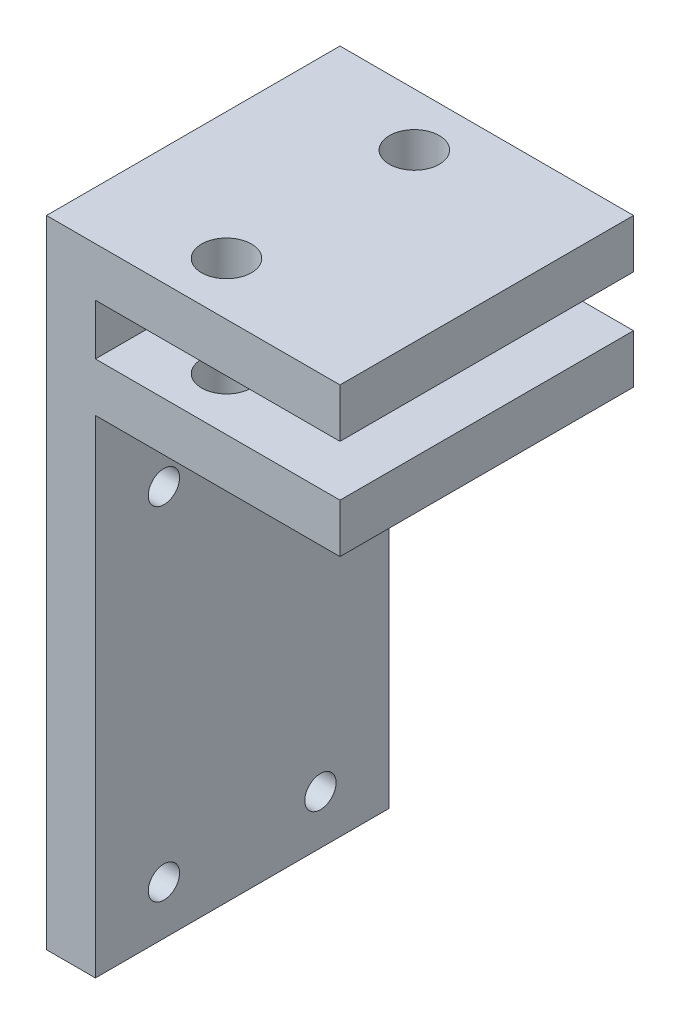
ISO-10303-21;
HEADER;
FILE_DESCRIPTION(('STEP AP214'),'2;1');
FILE_NAME('part.step','',(''),(''),'','','');
FILE_SCHEMA(('AUTOMOTIVE_DESIGN { 1 0 10303 214 1 1 1 1 }'));
ENDSEC;
DATA;
#1=APPLICATION_CONTEXT('core data for automotive mechanical design processes');
#2=APPLICATION_PROTOCOL_DEFINITION('international standard','automotive_design',2000,#1);
#3=PRODUCT_CONTEXT('',#1,'mechanical');
#4=PRODUCT('Part','Part','',(#3));
#5=PRODUCT_RELATED_PRODUCT_CATEGORY('part','',(#4));
#6=PRODUCT_DEFINITION_FORMATION('','',#4);
#7=PRODUCT_DEFINITION_CONTEXT('part definition',#1,'design');
#8=PRODUCT_DEFINITION('design','',#6,#7);
#9=PRODUCT_DEFINITION_SHAPE('','',#8);
#10=(LENGTH_UNIT() NAMED_UNIT(*) SI_UNIT(.MILLI.,.METRE.));
#11=(NAMED_UNIT(*) PLANE_ANGLE_UNIT() SI_UNIT($,.RADIAN.));
#12=(NAMED_UNIT(*) SI_UNIT($,.STERADIAN.) SOLID_ANGLE_UNIT());
#13=UNCERTAINTY_MEASURE_WITH_UNIT(LENGTH_MEASURE(1.E-05),#10,'distance_accuracy_value','');
#14=(GEOMETRIC_REPRESENTATION_CONTEXT(3) GLOBAL_UNCERTAINTY_ASSIGNED_CONTEXT((#13)) GLOBAL_UNIT_ASSIGNED_CONTEXT((#10,
#11,#12)) REPRESENTATION_CONTEXT('',''));
#15=CARTESIAN_POINT('',(0.,0.,0.));
#16=DIRECTION('',(0.,0.,1.));
#17=DIRECTION('',(1.,0.,0.));
#18=AXIS2_PLACEMENT_3D('',#15,#16,#17);
#19=CARTESIAN_POINT('',(-25.,0.,30.));
#20=DIRECTION('',(0.,1.,0.));
#21=DIRECTION('',(0.,0.,1.));
#22=AXIS2_PLACEMENT_3D('',#19,#20,#21);
#23=PLANE('',#22);
#24=CARTESIAN_POINT('',(-17.,0.,5.4));
#25=DIRECTION('',(0.,1.,0.));
#26=DIRECTION('',(0.,0.,1.));
#27=AXIS2_PLACEMENT_3D('',#24,#25,#26);
#28=CIRCLE('',#27,2.55);
#29=CARTESIAN_POINT('',(-17.,0.,7.95));
#30=VERTEX_POINT('',#29);
#31=EDGE_CURVE('E240',#30,#30,#28,.T.);
#32=ORIENTED_EDGE('',*,*,#31,.T.);
#33=EDGE_LOOP('',(#32));
#34=FACE_BOUND('',#33,.T.);
#35=CARTESIAN_POINT('',(-17.,0.,24.6));
#36=DIRECTION('',(0.,1.,0.));
#37=DIRECTION('',(0.,0.,1.));
#38=AXIS2_PLACEMENT_3D('',#35,#36,#37);
#39=CIRCLE('',#38,2.55);
#40=CARTESIAN_POINT('',(-17.,0.,27.15));
#41=VERTEX_POINT('',#40);
#42=EDGE_CURVE('E222',#41,#41,#39,.T.);
#43=ORIENTED_EDGE('',*,*,#42,.T.);
#44=EDGE_LOOP('',(#43));
#45=FACE_BOUND('',#44,.T.);
#46=DIRECTION('',(1.,0.,0.));
#47=VECTOR('',#46,1.);
#48=CARTESIAN_POINT('',(-25.,0.,0.));
#49=LINE('',#48,#47);
#50=CARTESIAN_POINT('',(-25.,0.,0.));
#51=VERTEX_POINT('',#50);
#52=CARTESIAN_POINT('',(0.,0.,0.));
#53=VERTEX_POINT('',#52);
#54=EDGE_CURVE('E158',#51,#53,#49,.T.);
#55=ORIENTED_EDGE('',*,*,#54,.T.);
#56=DIRECTION('',(0.,0.,-1.));
#57=VECTOR('',#56,1.);
#58=CARTESIAN_POINT('',(0.,0.,30.));
#59=LINE('',#58,#57);
#60=CARTESIAN_POINT('',(0.,0.,30.));
#61=VERTEX_POINT('',#60);
#62=EDGE_CURVE('E11',#61,#53,#59,.T.);
#63=ORIENTED_EDGE('',*,*,#62,.F.);
#64=DIRECTION('',(1.,0.,0.));
#65=VECTOR('',#64,1.);
#66=CARTESIAN_POINT('',(-25.,0.,30.));
#67=LINE('',#66,#65);
#68=CARTESIAN_POINT('',(-25.,0.,30.));
#69=VERTEX_POINT('',#68);
#70=EDGE_CURVE('E187',#69,#61,#67,.T.);
#71=ORIENTED_EDGE('',*,*,#70,.F.);
#72=DIRECTION('',(0.,0.,-1.));
#73=VECTOR('',#72,1.);
#74=CARTESIAN_POINT('',(-25.,0.,30.));
#75=LINE('',#74,#73);
#76=EDGE_CURVE('E154',#69,#51,#75,.T.);
#77=ORIENTED_EDGE('',*,*,#76,.T.);
#78=EDGE_LOOP('',(#55,#63,#71,#77));
#79=FACE_BOUND('',#78,.T.);
#80=ADVANCED_FACE('F43',(#34,#45,#79),#23,.F.);
#81=CARTESIAN_POINT('',(0.,0.,30.));
#82=DIRECTION('',(-1.,0.,0.));
#83=DIRECTION('',(0.,0.,1.));
#84=AXIS2_PLACEMENT_3D('',#81,#82,#83);
#85=PLANE('',#84);
#86=DIRECTION('',(0.,1.,0.));
#87=VECTOR('',#86,1.);
#88=CARTESIAN_POINT('',(0.,0.,0.));
#89=LINE('',#88,#87);
#90=CARTESIAN_POINT('',(0.,5.,0.));
#91=VERTEX_POINT('',#90);
#92=EDGE_CURVE('E162',#53,#91,#89,.T.);
#93=ORIENTED_EDGE('',*,*,#92,.T.);
#94=DIRECTION('',(0.,0.,-1.));
#95=VECTOR('',#94,1.);
#96=CARTESIAN_POINT('',(0.,5.,30.));
#97=LINE('',#96,#95);
#98=CARTESIAN_POINT('',(0.,5.,30.));
#99=VERTEX_POINT('',#98);
#100=EDGE_CURVE('E53',#99,#91,#97,.T.);
#101=ORIENTED_EDGE('',*,*,#100,.F.);
#102=DIRECTION('',(0.,1.,0.));
#103=VECTOR('',#102,1.);
#104=CARTESIAN_POINT('',(0.,0.,30.));
#105=LINE('',#104,#103);
#106=EDGE_CURVE('E111',#61,#99,#105,.T.);
#107=ORIENTED_EDGE('',*,*,#106,.F.);
#108=ORIENTED_EDGE('',*,*,#62,.T.);
#109=EDGE_LOOP('',(#93,#101,#107,#108));
#110=FACE_BOUND('',#109,.T.);
#111=ADVANCED_FACE('F333',(#110),#85,.F.);
#112=CARTESIAN_POINT('',(0.,5.,30.));
#113=DIRECTION('',(0.,-1.,0.));
#114=DIRECTION('',(1.,0.,0.));
#115=AXIS2_PLACEMENT_3D('',#112,#113,#114);
#116=PLANE('',#115);
#117=CARTESIAN_POINT('',(-17.,5.,5.4));
#118=DIRECTION('',(0.,1.,0.));
#119=DIRECTION('',(-1.,0.,0.));
#120=AXIS2_PLACEMENT_3D('',#117,#118,#119);
#121=CIRCLE('',#120,2.55);
#122=CARTESIAN_POINT('',(-19.55,5.,5.4));
#123=VERTEX_POINT('',#122);
#124=EDGE_CURVE('E216',#123,#123,#121,.T.);
#125=ORIENTED_EDGE('',*,*,#124,.F.);
#126=EDGE_LOOP('',(#125));
#127=FACE_BOUND('',#126,.T.);
#128=CARTESIAN_POINT('',(-17.,5.,24.6));
#129=DIRECTION('',(0.,1.,0.));
#130=DIRECTION('',(1.,0.,0.));
#131=AXIS2_PLACEMENT_3D('',#128,#129,#130);
#132=CIRCLE('',#131,2.55);
#133=CARTESIAN_POINT('',(-14.45,5.,24.6));
#134=VERTEX_POINT('',#133);
#135=EDGE_CURVE('E225',#134,#134,#132,.T.);
#136=ORIENTED_EDGE('',*,*,#135,.F.);
#137=EDGE_LOOP('',(#136));
#138=FACE_BOUND('',#137,.T.);
#139=DIRECTION('',(-1.,0.,0.));
#140=VECTOR('',#139,1.);
#141=CARTESIAN_POINT('',(0.,5.,0.));
#142=LINE('',#141,#140);
#143=CARTESIAN_POINT('',(-30.,5.,0.));
#144=VERTEX_POINT('',#143);
#145=EDGE_CURVE('E166',#91,#144,#142,.T.);
#146=ORIENTED_EDGE('',*,*,#145,.T.);
#147=DIRECTION('',(0.,0.,-1.));
#148=VECTOR('',#147,1.);
#149=CARTESIAN_POINT('',(-30.,5.,30.));
#150=LINE('',#149,#148);
#151=CARTESIAN_POINT('',(-30.,5.,30.));
#152=VERTEX_POINT('',#151);
#153=EDGE_CURVE('E206',#152,#144,#150,.T.);
#154=ORIENTED_EDGE('',*,*,#153,.F.);
#155=DIRECTION('',(-1.,0.,0.));
#156=VECTOR('',#155,1.);
#157=CARTESIAN_POINT('',(0.,5.,30.));
#158=LINE('',#157,#156);
#159=EDGE_CURVE('E279',#99,#152,#158,.T.);
#160=ORIENTED_EDGE('',*,*,#159,.F.);
#161=ORIENTED_EDGE('',*,*,#100,.T.);
#162=EDGE_LOOP('',(#146,#154,#160,#161));
#163=FACE_BOUND('',#162,.T.);
#164=ADVANCED_FACE('F338',(#127,#138,#163),#116,.F.);
#165=CARTESIAN_POINT('',(-30.,5.,30.));
#166=DIRECTION('',(1.,0.,0.));
#167=DIRECTION('',(0.,1.,0.));
#168=AXIS2_PLACEMENT_3D('',#165,#166,#167);
#169=PLANE('',#168);
#170=CARTESIAN_POINT('',(-30.,-20.,23.));
#171=DIRECTION('',(-1.,0.,0.));
#172=DIRECTION('',(0.,-1.,0.));
#173=AXIS2_PLACEMENT_3D('',#170,#171,#172);
#174=CIRCLE('',#173,1.6);
#175=CARTESIAN_POINT('',(-30.,-21.6,23.));
#176=VERTEX_POINT('',#175);
#177=EDGE_CURVE('E257',#176,#176,#174,.T.);
#178=ORIENTED_EDGE('',*,*,#177,.F.);
#179=EDGE_LOOP('',(#178));
#180=FACE_BOUND('',#179,.T.);
#181=CARTESIAN_POINT('',(-30.,-55.,6.99999999999999));
#182=DIRECTION('',(-1.,0.,0.));
#183=DIRECTION('',(0.,-1.,0.));
#184=AXIS2_PLACEMENT_3D('',#181,#182,#183);
#185=CIRCLE('',#184,1.6);
#186=CARTESIAN_POINT('',(-30.,-56.6,6.99999999999999));
#187=VERTEX_POINT('',#186);
#188=EDGE_CURVE('E258',#187,#187,#185,.T.);
#189=ORIENTED_EDGE('',*,*,#188,.F.);
#190=EDGE_LOOP('',(#189));
#191=FACE_BOUND('',#190,.T.);
#192=CARTESIAN_POINT('',(-30.,-55.,23.));
#193=DIRECTION('',(-1.,0.,0.));
#194=DIRECTION('',(0.,-1.,0.));
#195=AXIS2_PLACEMENT_3D('',#192,#193,#194);
#196=CIRCLE('',#195,1.6);
#197=CARTESIAN_POINT('',(-30.,-56.6,23.));
#198=VERTEX_POINT('',#197);
#199=EDGE_CURVE('E248',#198,#198,#196,.T.);
#200=ORIENTED_EDGE('',*,*,#199,.F.);
#201=EDGE_LOOP('',(#200));
#202=FACE_BOUND('',#201,.T.);
#203=CARTESIAN_POINT('',(-30.,-20.,6.99999999999999));
#204=DIRECTION('',(-1.,0.,0.));
#205=DIRECTION('',(0.,-1.,0.));
#206=AXIS2_PLACEMENT_3D('',#203,#204,#205);
#207=CIRCLE('',#206,1.6);
#208=CARTESIAN_POINT('',(-30.,-21.6,6.99999999999999));
#209=VERTEX_POINT('',#208);
#210=EDGE_CURVE('E262',#209,#209,#207,.T.);
#211=ORIENTED_EDGE('',*,*,#210,.F.);
#212=EDGE_LOOP('',(#211));
#213=FACE_BOUND('',#212,.T.);
#214=DIRECTION('',(0.,-1.,0.));
#215=VECTOR('',#214,1.);
#216=CARTESIAN_POINT('',(-30.,5.,0.));
#217=LINE('',#216,#215);
#218=CARTESIAN_POINT('',(-30.,-60.,0.));
#219=VERTEX_POINT('',#218);
#220=EDGE_CURVE('E169',#144,#219,#217,.T.);
#221=ORIENTED_EDGE('',*,*,#220,.T.);
#222=DIRECTION('',(0.,0.,-1.));
#223=VECTOR('',#222,1.);
#224=CARTESIAN_POINT('',(-30.,-60.,30.));
#225=LINE('',#224,#223);
#226=CARTESIAN_POINT('',(-30.,-60.,30.));
#227=VERTEX_POINT('',#226);
#228=EDGE_CURVE('E202',#227,#219,#225,.T.);
#229=ORIENTED_EDGE('',*,*,#228,.F.);
#230=DIRECTION('',(0.,-1.,0.));
#231=VECTOR('',#230,1.);
#232=CARTESIAN_POINT('',(-30.,5.,30.));
#233=LINE('',#232,#231);
#234=EDGE_CURVE('E282',#152,#227,#233,.T.);
#235=ORIENTED_EDGE('',*,*,#234,.F.);
#236=ORIENTED_EDGE('',*,*,#153,.T.);
#237=EDGE_LOOP('',(#221,#229,#235,#236));
#238=FACE_BOUND('',#237,.T.);
#239=ADVANCED_FACE('F414',(#180,#191,#202,#213,#238),#169,.F.);
#240=CARTESIAN_POINT('',(-30.,-60.,30.));
#241=DIRECTION('',(0.,1.,0.));
#242=DIRECTION('',(-1.,0.,0.));
#243=AXIS2_PLACEMENT_3D('',#240,#241,#242);
#244=PLANE('',#243);
#245=DIRECTION('',(1.,0.,0.));
#246=VECTOR('',#245,1.);
#247=CARTESIAN_POINT('',(-30.,-60.,0.));
#248=LINE('',#247,#246);
#249=CARTESIAN_POINT('',(-25.,-60.,0.));
#250=VERTEX_POINT('',#249);
#251=EDGE_CURVE('E172',#219,#250,#248,.T.);
#252=ORIENTED_EDGE('',*,*,#251,.T.);
#253=DIRECTION('',(0.,0.,-1.));
#254=VECTOR('',#253,1.);
#255=CARTESIAN_POINT('',(-25.,-60.,30.));
#256=LINE('',#255,#254);
#257=CARTESIAN_POINT('',(-25.,-60.,30.));
#258=VERTEX_POINT('',#257);
#259=EDGE_CURVE('E198',#258,#250,#256,.T.);
#260=ORIENTED_EDGE('',*,*,#259,.F.);
#261=DIRECTION('',(1.,0.,0.));
#262=VECTOR('',#261,1.);
#263=CARTESIAN_POINT('',(-30.,-60.,30.));
#264=LINE('',#263,#262);
#265=EDGE_CURVE('E285',#227,#258,#264,.T.);
#266=ORIENTED_EDGE('',*,*,#265,.F.);
#267=ORIENTED_EDGE('',*,*,#228,.T.);
#268=EDGE_LOOP('',(#252,#260,#266,#267));
#269=FACE_BOUND('',#268,.T.);
#270=ADVANCED_FACE('F502',(#269),#244,.F.);
#271=CARTESIAN_POINT('',(-25.,-60.,30.));
#272=DIRECTION('',(-1.,0.,0.));
#273=DIRECTION('',(0.,0.,1.));
#274=AXIS2_PLACEMENT_3D('',#271,#272,#273);
#275=PLANE('',#274);
#276=CARTESIAN_POINT('',(-25.,-20.,23.));
#277=DIRECTION('',(-1.,0.,0.));
#278=DIRECTION('',(0.,0.,1.));
#279=AXIS2_PLACEMENT_3D('',#276,#277,#278);
#280=CIRCLE('',#279,1.6);
#281=CARTESIAN_POINT('',(-25.,-20.,24.6));
#282=VERTEX_POINT('',#281);
#283=EDGE_CURVE('E253',#282,#282,#280,.F.);
#284=ORIENTED_EDGE('',*,*,#283,.F.);
#285=EDGE_LOOP('',(#284));
#286=FACE_BOUND('',#285,.T.);
#287=CARTESIAN_POINT('',(-25.,-55.,6.99999999999999));
#288=DIRECTION('',(-1.,0.,0.));
#289=DIRECTION('',(0.,0.,1.));
#290=AXIS2_PLACEMENT_3D('',#287,#288,#289);
#291=CIRCLE('',#290,1.6);
#292=CARTESIAN_POINT('',(-25.,-55.,8.59999999999999));
#293=VERTEX_POINT('',#292);
#294=EDGE_CURVE('E252',#293,#293,#291,.F.);
#295=ORIENTED_EDGE('',*,*,#294,.F.);
#296=EDGE_LOOP('',(#295));
#297=FACE_BOUND('',#296,.T.);
#298=CARTESIAN_POINT('',(-25.,-55.,23.));
#299=DIRECTION('',(-1.,0.,0.));
#300=DIRECTION('',(0.,0.,1.));
#301=AXIS2_PLACEMENT_3D('',#298,#299,#300);
#302=CIRCLE('',#301,1.6);
#303=CARTESIAN_POINT('',(-25.,-55.,24.6));
#304=VERTEX_POINT('',#303);
#305=EDGE_CURVE('E244',#304,#304,#302,.F.);
#306=ORIENTED_EDGE('',*,*,#305,.F.);
#307=EDGE_LOOP('',(#306));
#308=FACE_BOUND('',#307,.T.);
#309=CARTESIAN_POINT('',(-25.,-20.,6.99999999999999));
#310=DIRECTION('',(-1.,0.,0.));
#311=DIRECTION('',(0.,0.,1.));
#312=AXIS2_PLACEMENT_3D('',#309,#310,#311);
#313=CIRCLE('',#312,1.6);
#314=CARTESIAN_POINT('',(-25.,-20.,8.59999999999999));
#315=VERTEX_POINT('',#314);
#316=EDGE_CURVE('E163',#315,#315,#313,.F.);
#317=ORIENTED_EDGE('',*,*,#316,.F.);
#318=EDGE_LOOP('',(#317));
#319=FACE_BOUND('',#318,.T.);
#320=DIRECTION('',(0.,1.,0.));
#321=VECTOR('',#320,1.);
#322=CARTESIAN_POINT('',(-25.,-60.,0.));
#323=LINE('',#322,#321);
#324=CARTESIAN_POINT('',(-25.,-10.2,0.));
#325=VERTEX_POINT('',#324);
#326=EDGE_CURVE('E175',#250,#325,#323,.T.);
#327=ORIENTED_EDGE('',*,*,#326,.T.);
#328=DIRECTION('',(0.,0.,-1.));
#329=VECTOR('',#328,1.);
#330=CARTESIAN_POINT('',(-25.,-10.2,30.));
#331=LINE('',#330,#329);
#332=CARTESIAN_POINT('',(-25.,-10.2,30.));
#333=VERTEX_POINT('',#332);
#334=EDGE_CURVE('E194',#333,#325,#331,.T.);
#335=ORIENTED_EDGE('',*,*,#334,.F.);
#336=DIRECTION('',(0.,1.,0.));
#337=VECTOR('',#336,1.);
#338=CARTESIAN_POINT('',(-25.,-60.,30.));
#339=LINE('',#338,#337);
#340=EDGE_CURVE('E288',#258,#333,#339,.T.);
#341=ORIENTED_EDGE('',*,*,#340,.F.);
#342=ORIENTED_EDGE('',*,*,#259,.T.);
#343=EDGE_LOOP('',(#327,#335,#341,#342));
#344=FACE_BOUND('',#343,.T.);
#345=ADVANCED_FACE('F308',(#286,#297,#308,#319,#344),#275,.F.);
#346=CARTESIAN_POINT('',(0.,-10.2,30.));
#347=DIRECTION('',(0.,1.,0.));
#348=DIRECTION('',(-1.,0.,0.));
#349=AXIS2_PLACEMENT_3D('',#346,#347,#348);
#350=PLANE('',#349);
#351=CARTESIAN_POINT('',(-17.,-10.2,5.4));
#352=DIRECTION('',(0.,1.,0.));
#353=DIRECTION('',(-1.,0.,0.));
#354=AXIS2_PLACEMENT_3D('',#351,#352,#353);
#355=CIRCLE('',#354,2.55);
#356=CARTESIAN_POINT('',(-19.55,-10.2,5.4));
#357=VERTEX_POINT('',#356);
#358=EDGE_CURVE('E236',#357,#357,#355,.T.);
#359=ORIENTED_EDGE('',*,*,#358,.T.);
#360=EDGE_LOOP('',(#359));
#361=FACE_BOUND('',#360,.T.);
#362=CARTESIAN_POINT('',(-17.,-10.2,24.6));
#363=DIRECTION('',(0.,1.,0.));
#364=DIRECTION('',(-1.,0.,0.));
#365=AXIS2_PLACEMENT_3D('',#362,#363,#364);
#366=CIRCLE('',#365,2.55);
#367=CARTESIAN_POINT('',(-19.55,-10.2,24.6));
#368=VERTEX_POINT('',#367);
#369=EDGE_CURVE('E215',#368,#368,#366,.T.);
#370=ORIENTED_EDGE('',*,*,#369,.T.);
#371=EDGE_LOOP('',(#370));
#372=FACE_BOUND('',#371,.T.);
#373=DIRECTION('',(1.,0.,0.));
#374=VECTOR('',#373,1.);
#375=CARTESIAN_POINT('',(0.,-10.2,0.));
#376=LINE('',#375,#374);
#377=CARTESIAN_POINT('',(0.,-10.2,0.));
#378=VERTEX_POINT('',#377);
#379=EDGE_CURVE('E178',#325,#378,#376,.T.);
#380=ORIENTED_EDGE('',*,*,#379,.T.);
#381=DIRECTION('',(0.,0.,-1.));
#382=VECTOR('',#381,1.);
#383=CARTESIAN_POINT('',(0.,-10.2,30.));
#384=LINE('',#383,#382);
#385=CARTESIAN_POINT('',(0.,-10.2,30.));
#386=VERTEX_POINT('',#385);
#387=EDGE_CURVE('E147',#386,#378,#384,.T.);
#388=ORIENTED_EDGE('',*,*,#387,.F.);
#389=DIRECTION('',(1.,0.,0.));
#390=VECTOR('',#389,1.);
#391=CARTESIAN_POINT('',(0.,-10.2,30.));
#392=LINE('',#391,#390);
#393=EDGE_CURVE('E136',#333,#386,#392,.T.);
#394=ORIENTED_EDGE('',*,*,#393,.F.);
#395=ORIENTED_EDGE('',*,*,#334,.T.);
#396=EDGE_LOOP('',(#380,#388,#394,#395));
#397=FACE_BOUND('',#396,.T.);
#398=ADVANCED_FACE('F305',(#361,#372,#397),#350,.F.);
#399=CARTESIAN_POINT('',(0.,-5.2,30.));
#400=DIRECTION('',(-1.,0.,0.));
#401=DIRECTION('',(0.,-1.,0.));
#402=AXIS2_PLACEMENT_3D('',#399,#400,#401);
#403=PLANE('',#402);
#404=DIRECTION('',(0.,1.,0.));
#405=VECTOR('',#404,1.);
#406=CARTESIAN_POINT('',(0.,-5.2,0.));
#407=LINE('',#406,#405);
#408=CARTESIAN_POINT('',(0.,-5.2,0.));
#409=VERTEX_POINT('',#408);
#410=EDGE_CURVE('E145',#378,#409,#407,.T.);
#411=ORIENTED_EDGE('',*,*,#410,.T.);
#412=DIRECTION('',(0.,0.,-1.));
#413=VECTOR('',#412,1.);
#414=CARTESIAN_POINT('',(0.,-5.2,30.));
#415=LINE('',#414,#413);
#416=CARTESIAN_POINT('',(0.,-5.2,30.));
#417=VERTEX_POINT('',#416);
#418=EDGE_CURVE('E142',#417,#409,#415,.T.);
#419=ORIENTED_EDGE('',*,*,#418,.F.);
#420=DIRECTION('',(0.,1.,0.));
#421=VECTOR('',#420,1.);
#422=CARTESIAN_POINT('',(0.,-5.2,30.));
#423=LINE('',#422,#421);
#424=EDGE_CURVE('E130',#386,#417,#423,.T.);
#425=ORIENTED_EDGE('',*,*,#424,.F.);
#426=ORIENTED_EDGE('',*,*,#387,.T.);
#427=EDGE_LOOP('',(#411,#419,#425,#426));
#428=FACE_BOUND('',#427,.T.);
#429=ADVANCED_FACE('F143',(#428),#403,.F.);
#430=CARTESIAN_POINT('',(-25.,-5.2,30.));
#431=DIRECTION('',(0.,-1.,0.));
#432=DIRECTION('',(0.,0.,-1.));
#433=AXIS2_PLACEMENT_3D('',#430,#431,#432);
#434=PLANE('',#433);
#435=CARTESIAN_POINT('',(-17.,-5.2,5.4));
#436=DIRECTION('',(0.,-1.,0.));
#437=DIRECTION('',(0.,0.,-1.));
#438=AXIS2_PLACEMENT_3D('',#435,#436,#437);
#439=CIRCLE('',#438,2.55);
#440=CARTESIAN_POINT('',(-17.,-5.2,2.85));
#441=VERTEX_POINT('',#440);
#442=EDGE_CURVE('E46',#441,#441,#439,.T.);
#443=ORIENTED_EDGE('',*,*,#442,.T.);
#444=EDGE_LOOP('',(#443));
#445=FACE_BOUND('',#444,.T.);
#446=CARTESIAN_POINT('',(-17.,-5.2,24.6));
#447=DIRECTION('',(0.,-1.,0.));
#448=DIRECTION('',(0.,0.,-1.));
#449=AXIS2_PLACEMENT_3D('',#446,#447,#448);
#450=CIRCLE('',#449,2.55);
#451=CARTESIAN_POINT('',(-17.,-5.2,22.05));
#452=VERTEX_POINT('',#451);
#453=EDGE_CURVE('E212',#452,#452,#450,.T.);
#454=ORIENTED_EDGE('',*,*,#453,.T.);
#455=EDGE_LOOP('',(#454));
#456=FACE_BOUND('',#455,.T.);
#457=DIRECTION('',(-1.,0.,0.));
#458=VECTOR('',#457,1.);
#459=CARTESIAN_POINT('',(-25.,-5.2,0.));
#460=LINE('',#459,#458);
#461=CARTESIAN_POINT('',(-25.,-5.2,0.));
#462=VERTEX_POINT('',#461);
#463=EDGE_CURVE('E97',#409,#462,#460,.T.);
#464=ORIENTED_EDGE('',*,*,#463,.T.);
#465=DIRECTION('',(0.,0.,-1.));
#466=VECTOR('',#465,1.);
#467=CARTESIAN_POINT('',(-25.,-5.2,30.));
#468=LINE('',#467,#466);
#469=CARTESIAN_POINT('',(-25.,-5.2,30.));
#470=VERTEX_POINT('',#469);
#471=EDGE_CURVE('E148',#470,#462,#468,.T.);
#472=ORIENTED_EDGE('',*,*,#471,.F.);
#473=DIRECTION('',(-1.,0.,0.));
#474=VECTOR('',#473,1.);
#475=CARTESIAN_POINT('',(-25.,-5.2,30.));
#476=LINE('',#475,#474);
#477=EDGE_CURVE('E134',#417,#470,#476,.T.);
#478=ORIENTED_EDGE('',*,*,#477,.F.);
#479=ORIENTED_EDGE('',*,*,#418,.T.);
#480=EDGE_LOOP('',(#464,#472,#478,#479));
#481=FACE_BOUND('',#480,.T.);
#482=ADVANCED_FACE('F150',(#445,#456,#481),#434,.F.);
#483=CARTESIAN_POINT('',(-25.,-5.2,30.));
#484=DIRECTION('',(-1.,0.,0.));
#485=DIRECTION('',(0.,0.,1.));
#486=AXIS2_PLACEMENT_3D('',#483,#484,#485);
#487=PLANE('',#486);
#488=DIRECTION('',(0.,1.,0.));
#489=VECTOR('',#488,1.);
#490=CARTESIAN_POINT('',(-25.,-5.2,0.));
#491=LINE('',#490,#489);
#492=EDGE_CURVE('E103',#462,#51,#491,.T.);
#493=ORIENTED_EDGE('',*,*,#492,.T.);
#494=ORIENTED_EDGE('',*,*,#76,.F.);
#495=DIRECTION('',(0.,1.,0.));
#496=VECTOR('',#495,1.);
#497=CARTESIAN_POINT('',(-25.,-5.2,30.));
#498=LINE('',#497,#496);
#499=EDGE_CURVE('E62',#470,#69,#498,.T.);
#500=ORIENTED_EDGE('',*,*,#499,.F.);
#501=ORIENTED_EDGE('',*,*,#471,.T.);
#502=EDGE_LOOP('',(#493,#494,#500,#501));
#503=FACE_BOUND('',#502,.T.);
#504=ADVANCED_FACE('F322',(#503),#487,.F.);
#505=CARTESIAN_POINT('',(0.,0.,30.));
#506=DIRECTION('',(0.,0.,1.));
#507=DIRECTION('',(1.,0.,0.));
#508=AXIS2_PLACEMENT_3D('',#505,#506,#507);
#509=PLANE('',#508);
#510=ORIENTED_EDGE('',*,*,#70,.T.);
#511=ORIENTED_EDGE('',*,*,#106,.T.);
#512=ORIENTED_EDGE('',*,*,#159,.T.);
#513=ORIENTED_EDGE('',*,*,#234,.T.);
#514=ORIENTED_EDGE('',*,*,#265,.T.);
#515=ORIENTED_EDGE('',*,*,#340,.T.);
#516=ORIENTED_EDGE('',*,*,#393,.T.);
#517=ORIENTED_EDGE('',*,*,#424,.T.);
#518=ORIENTED_EDGE('',*,*,#477,.T.);
#519=ORIENTED_EDGE('',*,*,#499,.T.);
#520=EDGE_LOOP('',(#510,#511,#512,#513,#514,#515,#516,#517,#518,#519));
#521=FACE_BOUND('',#520,.T.);
#522=ADVANCED_FACE('F132',(#521),#509,.T.);
#523=CARTESIAN_POINT('',(0.,0.,0.));
#524=DIRECTION('',(0.,0.,1.));
#525=DIRECTION('',(1.,0.,0.));
#526=AXIS2_PLACEMENT_3D('',#523,#524,#525);
#527=PLANE('',#526);
#528=ORIENTED_EDGE('',*,*,#54,.F.);
#529=ORIENTED_EDGE('',*,*,#492,.F.);
#530=ORIENTED_EDGE('',*,*,#463,.F.);
#531=ORIENTED_EDGE('',*,*,#410,.F.);
#532=ORIENTED_EDGE('',*,*,#379,.F.);
#533=ORIENTED_EDGE('',*,*,#326,.F.);
#534=ORIENTED_EDGE('',*,*,#251,.F.);
#535=ORIENTED_EDGE('',*,*,#220,.F.);
#536=ORIENTED_EDGE('',*,*,#145,.F.);
#537=ORIENTED_EDGE('',*,*,#92,.F.);
#538=EDGE_LOOP('',(#528,#529,#530,#531,#532,#533,#534,#535,#536,#537));
#539=FACE_BOUND('',#538,.T.);
#540=ADVANCED_FACE('F317',(#539),#527,.F.);
#541=CARTESIAN_POINT('',(0.00100000000000447,-20.,6.99999999999999));
#542=DIRECTION('',(-1.,0.,0.));
#543=DIRECTION('',(0.,-1.,0.));
#544=AXIS2_PLACEMENT_3D('',#541,#542,#543);
#545=CYLINDRICAL_SURFACE('',#544,1.6);
#546=ORIENTED_EDGE('',*,*,#210,.T.);
#547=EDGE_LOOP('',(#546));
#548=FACE_BOUND('',#547,.T.);
#549=ORIENTED_EDGE('',*,*,#316,.T.);
#550=EDGE_LOOP('',(#549));
#551=FACE_BOUND('',#550,.T.);
#552=ADVANCED_FACE('F368',(#548,#551),#545,.F.);
#553=CARTESIAN_POINT('',(0.00100000000000794,-55.,23.));
#554=DIRECTION('',(-1.,0.,0.));
#555=DIRECTION('',(0.,-1.,0.));
#556=AXIS2_PLACEMENT_3D('',#553,#554,#555);
#557=CYLINDRICAL_SURFACE('',#556,1.6);
#558=ORIENTED_EDGE('',*,*,#199,.T.);
#559=EDGE_LOOP('',(#558));
#560=FACE_BOUND('',#559,.T.);
#561=ORIENTED_EDGE('',*,*,#305,.T.);
#562=EDGE_LOOP('',(#561));
#563=FACE_BOUND('',#562,.T.);
#564=ADVANCED_FACE('F363',(#560,#563),#557,.F.);
#565=CARTESIAN_POINT('',(0.00100000000000794,-55.,6.99999999999999));
#566=DIRECTION('',(-1.,0.,0.));
#567=DIRECTION('',(0.,-1.,0.));
#568=AXIS2_PLACEMENT_3D('',#565,#566,#567);
#569=CYLINDRICAL_SURFACE('',#568,1.6);
#570=ORIENTED_EDGE('',*,*,#188,.T.);
#571=EDGE_LOOP('',(#570));
#572=FACE_BOUND('',#571,.T.);
#573=ORIENTED_EDGE('',*,*,#294,.T.);
#574=EDGE_LOOP('',(#573));
#575=FACE_BOUND('',#574,.T.);
#576=ADVANCED_FACE('F356',(#572,#575),#569,.F.);
#577=CARTESIAN_POINT('',(0.00100000000000447,-20.,23.));
#578=DIRECTION('',(-1.,0.,0.));
#579=DIRECTION('',(0.,-1.,0.));
#580=AXIS2_PLACEMENT_3D('',#577,#578,#579);
#581=CYLINDRICAL_SURFACE('',#580,1.6);
#582=ORIENTED_EDGE('',*,*,#177,.T.);
#583=EDGE_LOOP('',(#582));
#584=FACE_BOUND('',#583,.T.);
#585=ORIENTED_EDGE('',*,*,#283,.T.);
#586=EDGE_LOOP('',(#585));
#587=FACE_BOUND('',#586,.T.);
#588=ADVANCED_FACE('F351',(#584,#587),#581,.F.);
#589=CARTESIAN_POINT('',(-17.,-60.,24.6));
#590=DIRECTION('',(0.,1.,0.));
#591=DIRECTION('',(-1.,0.,0.));
#592=AXIS2_PLACEMENT_3D('',#589,#590,#591);
#593=CYLINDRICAL_SURFACE('',#592,2.55);
#594=ORIENTED_EDGE('',*,*,#453,.F.);
#595=EDGE_LOOP('',(#594));
#596=FACE_BOUND('',#595,.T.);
#597=ORIENTED_EDGE('',*,*,#369,.F.);
#598=EDGE_LOOP('',(#597));
#599=FACE_BOUND('',#598,.T.);
#600=ADVANCED_FACE('F300',(#596,#599),#593,.F.);
#601=CARTESIAN_POINT('',(-17.,-60.,5.4));
#602=DIRECTION('',(0.,1.,0.));
#603=DIRECTION('',(-1.,0.,0.));
#604=AXIS2_PLACEMENT_3D('',#601,#602,#603);
#605=CYLINDRICAL_SURFACE('',#604,2.55);
#606=ORIENTED_EDGE('',*,*,#442,.F.);
#607=EDGE_LOOP('',(#606));
#608=FACE_BOUND('',#607,.T.);
#609=ORIENTED_EDGE('',*,*,#358,.F.);
#610=EDGE_LOOP('',(#609));
#611=FACE_BOUND('',#610,.T.);
#612=ADVANCED_FACE('F296',(#608,#611),#605,.F.);
#613=ORIENTED_EDGE('',*,*,#135,.T.);
#614=EDGE_LOOP('',(#613));
#615=FACE_BOUND('',#614,.T.);
#616=ORIENTED_EDGE('',*,*,#42,.F.);
#617=EDGE_LOOP('',(#616));
#618=FACE_BOUND('',#617,.T.);
#619=ADVANCED_FACE('F299',(#615,#618),#593,.F.);
#620=ORIENTED_EDGE('',*,*,#124,.T.);
#621=EDGE_LOOP('',(#620));
#622=FACE_BOUND('',#621,.T.);
#623=ORIENTED_EDGE('',*,*,#31,.F.);
#624=EDGE_LOOP('',(#623));
#625=FACE_BOUND('',#624,.T.);
#626=ADVANCED_FACE('F302',(#622,#625),#605,.F.);
#627=CLOSED_SHELL('',(#80,#111,#164,#239,#270,#345,#398,#429,#482,#504,#522,#540,#552,#564,#576,
#588,#600,#612,#619,#626));
#628=MANIFOLD_SOLID_BREP('B2',#627);
#629=ADVANCED_BREP_SHAPE_REPRESENTATION('',(#18,#628),#14);
#630=SHAPE_DEFINITION_REPRESENTATION(#9,#629);
ENDSEC;
END-ISO-10303-21;
